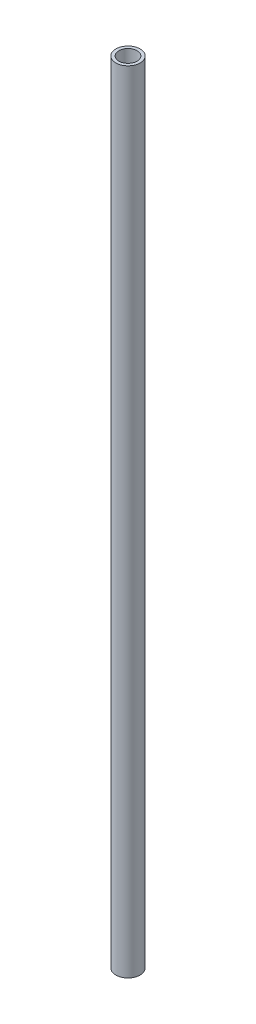
ISO-10303-21;
HEADER;
FILE_DESCRIPTION(('STEP AP214'),'2;1');
FILE_NAME('part.step','',(''),(''),'','','');
FILE_SCHEMA(('AUTOMOTIVE_DESIGN { 1 0 10303 214 1 1 1 1 }'));
ENDSEC;
DATA;
#1=APPLICATION_CONTEXT('core data for automotive mechanical design processes');
#2=APPLICATION_PROTOCOL_DEFINITION('international standard','automotive_design',2000,#1);
#3=PRODUCT_CONTEXT('',#1,'mechanical');
#4=PRODUCT('Part','Part','',(#3));
#5=PRODUCT_RELATED_PRODUCT_CATEGORY('part','',(#4));
#6=PRODUCT_DEFINITION_FORMATION('','',#4);
#7=PRODUCT_DEFINITION_CONTEXT('part definition',#1,'design');
#8=PRODUCT_DEFINITION('design','',#6,#7);
#9=PRODUCT_DEFINITION_SHAPE('','',#8);
#10=(LENGTH_UNIT() NAMED_UNIT(*) SI_UNIT(.MILLI.,.METRE.));
#11=(NAMED_UNIT(*) PLANE_ANGLE_UNIT() SI_UNIT($,.RADIAN.));
#12=(NAMED_UNIT(*) SI_UNIT($,.STERADIAN.) SOLID_ANGLE_UNIT());
#13=UNCERTAINTY_MEASURE_WITH_UNIT(LENGTH_MEASURE(1.E-05),#10,'distance_accuracy_value','');
#14=(GEOMETRIC_REPRESENTATION_CONTEXT(3) GLOBAL_UNCERTAINTY_ASSIGNED_CONTEXT((#13)) GLOBAL_UNIT_ASSIGNED_CONTEXT((#10,
#11,#12)) REPRESENTATION_CONTEXT('',''));
#15=CARTESIAN_POINT('',(0.,0.,0.));
#16=DIRECTION('',(0.,0.,1.));
#17=DIRECTION('',(1.,0.,0.));
#18=AXIS2_PLACEMENT_3D('',#15,#16,#17);
#19=CARTESIAN_POINT('',(0.,32.5,0.));
#20=DIRECTION('',(0.,1.,0.));
#21=DIRECTION('',(0.,0.,1.));
#22=AXIS2_PLACEMENT_3D('',#19,#20,#21);
#23=PLANE('',#22);
#24=CARTESIAN_POINT('',(0.,32.5,0.));
#25=DIRECTION('',(0.,1.,0.));
#26=DIRECTION('',(0.,0.,1.));
#27=AXIS2_PLACEMENT_3D('',#24,#25,#26);
#28=CIRCLE('',#27,1.);
#29=CARTESIAN_POINT('',(0.,32.5,1.));
#30=VERTEX_POINT('',#29);
#31=EDGE_CURVE('E10',#30,#30,#28,.T.);
#32=ORIENTED_EDGE('',*,*,#31,.T.);
#33=EDGE_LOOP('',(#32));
#34=FACE_BOUND('',#33,.T.);
#35=CARTESIAN_POINT('',(0.,32.5,0.));
#36=DIRECTION('',(0.,1.,0.));
#37=DIRECTION('',(0.,0.,1.));
#38=AXIS2_PLACEMENT_3D('',#35,#36,#37);
#39=CIRCLE('',#38,0.75);
#40=CARTESIAN_POINT('',(0.,32.5,0.75));
#41=VERTEX_POINT('',#40);
#42=EDGE_CURVE('E46',#41,#41,#39,.T.);
#43=ORIENTED_EDGE('',*,*,#42,.F.);
#44=EDGE_LOOP('',(#43));
#45=FACE_BOUND('',#44,.T.);
#46=ADVANCED_FACE('F35',(#34,#45),#23,.T.);
#47=CARTESIAN_POINT('',(0.,-32.5,0.));
#48=DIRECTION('',(0.,1.,0.));
#49=DIRECTION('',(0.,0.,1.));
#50=AXIS2_PLACEMENT_3D('',#47,#48,#49);
#51=PLANE('',#50);
#52=CARTESIAN_POINT('',(0.,-32.5,0.));
#53=DIRECTION('',(0.,1.,0.));
#54=DIRECTION('',(0.,0.,1.));
#55=AXIS2_PLACEMENT_3D('',#52,#53,#54);
#56=CIRCLE('',#55,1.);
#57=CARTESIAN_POINT('',(0.,-32.5,1.));
#58=VERTEX_POINT('',#57);
#59=EDGE_CURVE('E39',#58,#58,#56,.T.);
#60=ORIENTED_EDGE('',*,*,#59,.F.);
#61=EDGE_LOOP('',(#60));
#62=FACE_BOUND('',#61,.T.);
#63=CARTESIAN_POINT('',(0.,-32.5,0.));
#64=DIRECTION('',(0.,1.,0.));
#65=DIRECTION('',(0.,0.,1.));
#66=AXIS2_PLACEMENT_3D('',#63,#64,#65);
#67=CIRCLE('',#66,0.75);
#68=CARTESIAN_POINT('',(0.,-32.5,0.75));
#69=VERTEX_POINT('',#68);
#70=EDGE_CURVE('E48',#69,#69,#67,.T.);
#71=ORIENTED_EDGE('',*,*,#70,.T.);
#72=EDGE_LOOP('',(#71));
#73=FACE_BOUND('',#72,.T.);
#74=ADVANCED_FACE('F58',(#62,#73),#51,.F.);
#75=CARTESIAN_POINT('',(0.,32.5,0.));
#76=DIRECTION('',(0.,-1.,0.));
#77=DIRECTION('',(0.,0.,-1.));
#78=AXIS2_PLACEMENT_3D('',#75,#76,#77);
#79=CYLINDRICAL_SURFACE('',#78,1.);
#80=ORIENTED_EDGE('',*,*,#31,.F.);
#81=EDGE_LOOP('',(#80));
#82=FACE_BOUND('',#81,.T.);
#83=ORIENTED_EDGE('',*,*,#59,.T.);
#84=EDGE_LOOP('',(#83));
#85=FACE_BOUND('',#84,.T.);
#86=ADVANCED_FACE('F37',(#82,#85),#79,.T.);
#87=CARTESIAN_POINT('',(0.,32.5,0.));
#88=DIRECTION('',(0.,-1.,0.));
#89=DIRECTION('',(0.,0.,-1.));
#90=AXIS2_PLACEMENT_3D('',#87,#88,#89);
#91=CYLINDRICAL_SURFACE('',#90,0.75);
#92=ORIENTED_EDGE('',*,*,#42,.T.);
#93=EDGE_LOOP('',(#92));
#94=FACE_BOUND('',#93,.T.);
#95=ORIENTED_EDGE('',*,*,#70,.F.);
#96=EDGE_LOOP('',(#95));
#97=FACE_BOUND('',#96,.T.);
#98=ADVANCED_FACE('F54',(#94,#97),#91,.F.);
#99=CLOSED_SHELL('',(#46,#74,#86,#98));
#100=MANIFOLD_SOLID_BREP('B2',#99);
#101=ADVANCED_BREP_SHAPE_REPRESENTATION('',(#18,#100),#14);
#102=SHAPE_DEFINITION_REPRESENTATION(#9,#101);
ENDSEC;
END-ISO-10303-21;
